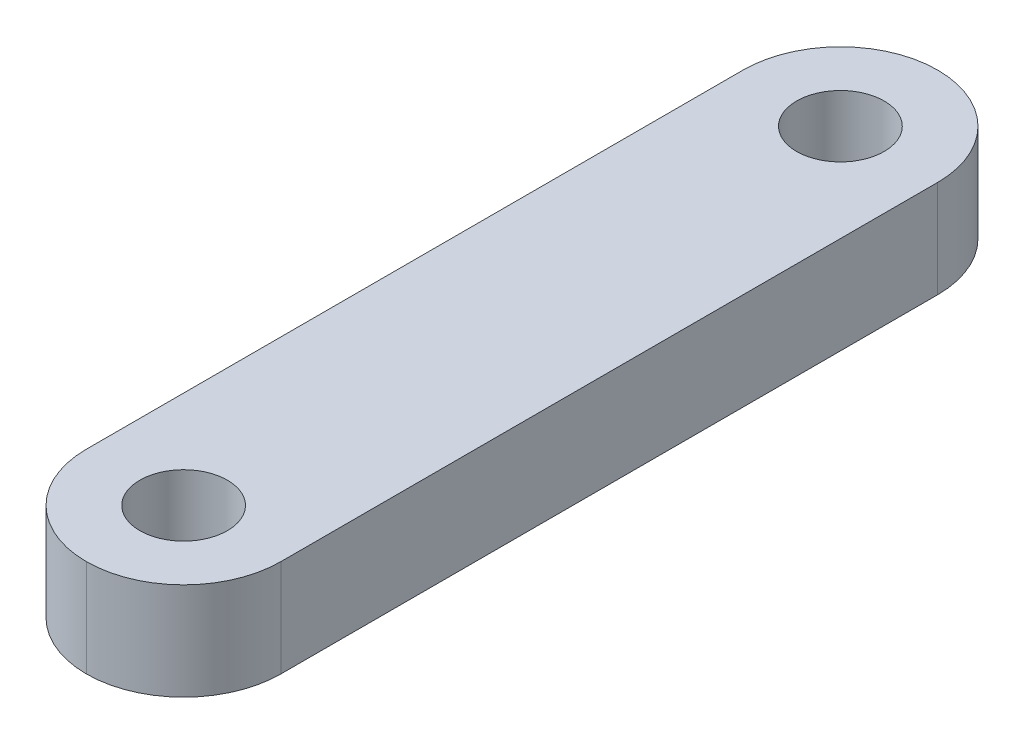
ISO-10303-21;
HEADER;
FILE_DESCRIPTION(('STEP AP214'),'2;1');
FILE_NAME('part.step','',(''),(''),'','','');
FILE_SCHEMA(('AUTOMOTIVE_DESIGN { 1 0 10303 214 1 1 1 1 }'));
ENDSEC;
DATA;
#1=APPLICATION_CONTEXT('core data for automotive mechanical design processes');
#2=APPLICATION_PROTOCOL_DEFINITION('international standard','automotive_design',2000,#1);
#3=PRODUCT_CONTEXT('',#1,'mechanical');
#4=PRODUCT('Part','Part','',(#3));
#5=PRODUCT_RELATED_PRODUCT_CATEGORY('part','',(#4));
#6=PRODUCT_DEFINITION_FORMATION('','',#4);
#7=PRODUCT_DEFINITION_CONTEXT('part definition',#1,'design');
#8=PRODUCT_DEFINITION('design','',#6,#7);
#9=PRODUCT_DEFINITION_SHAPE('','',#8);
#10=(LENGTH_UNIT() NAMED_UNIT(*) SI_UNIT(.MILLI.,.METRE.));
#11=(NAMED_UNIT(*) PLANE_ANGLE_UNIT() SI_UNIT($,.RADIAN.));
#12=(NAMED_UNIT(*) SI_UNIT($,.STERADIAN.) SOLID_ANGLE_UNIT());
#13=UNCERTAINTY_MEASURE_WITH_UNIT(LENGTH_MEASURE(1.E-05),#10,'distance_accuracy_value','');
#14=(GEOMETRIC_REPRESENTATION_CONTEXT(3) GLOBAL_UNCERTAINTY_ASSIGNED_CONTEXT((#13)) GLOBAL_UNIT_ASSIGNED_CONTEXT((#10,
#11,#12)) REPRESENTATION_CONTEXT('',''));
#15=CARTESIAN_POINT('',(0.,0.,0.));
#16=DIRECTION('',(0.,0.,1.));
#17=DIRECTION('',(1.,0.,0.));
#18=AXIS2_PLACEMENT_3D('',#15,#16,#17);
#19=CARTESIAN_POINT('',(0.,0.,35.));
#20=DIRECTION('',(1.,0.,0.));
#21=DIRECTION('',(0.,1.,0.));
#22=AXIS2_PLACEMENT_3D('',#19,#20,#21);
#23=PLANE('',#22);
#24=DIRECTION('',(0.,0.,-1.));
#25=VECTOR('',#24,1.);
#26=CARTESIAN_POINT('',(0.,0.,35.));
#27=LINE('',#26,#25);
#28=CARTESIAN_POINT('',(0.,0.,31.));
#29=VERTEX_POINT('',#28);
#30=CARTESIAN_POINT('',(0.,0.,4.));
#31=VERTEX_POINT('',#30);
#32=EDGE_CURVE('E140',#29,#31,#27,.T.);
#33=ORIENTED_EDGE('',*,*,#32,.T.);
#34=DIRECTION('',(0.,-1.,0.));
#35=VECTOR('',#34,1.);
#36=CARTESIAN_POINT('',(0.,0.,4.));
#37=LINE('',#36,#35);
#38=CARTESIAN_POINT('',(0.,-4.,4.));
#39=VERTEX_POINT('',#38);
#40=EDGE_CURVE('E107',#31,#39,#37,.T.);
#41=ORIENTED_EDGE('',*,*,#40,.T.);
#42=DIRECTION('',(0.,0.,-1.));
#43=VECTOR('',#42,1.);
#44=CARTESIAN_POINT('',(0.,-4.,35.));
#45=LINE('',#44,#43);
#46=CARTESIAN_POINT('',(0.,-4.,31.));
#47=VERTEX_POINT('',#46);
#48=EDGE_CURVE('E90',#47,#39,#45,.T.);
#49=ORIENTED_EDGE('',*,*,#48,.F.);
#50=DIRECTION('',(0.,-1.,0.));
#51=VECTOR('',#50,1.);
#52=CARTESIAN_POINT('',(0.,0.,31.));
#53=LINE('',#52,#51);
#54=EDGE_CURVE('E104',#47,#29,#53,.F.);
#55=ORIENTED_EDGE('',*,*,#54,.T.);
#56=EDGE_LOOP('',(#33,#41,#49,#55));
#57=FACE_BOUND('',#56,.T.);
#58=ADVANCED_FACE('F33',(#57),#23,.F.);
#59=CARTESIAN_POINT('',(0.,-4.,35.));
#60=DIRECTION('',(0.,1.,0.));
#61=DIRECTION('',(0.,0.,1.));
#62=AXIS2_PLACEMENT_3D('',#59,#60,#61);
#63=PLANE('',#62);
#64=CARTESIAN_POINT('',(4.,-4.,31.));
#65=DIRECTION('',(0.,1.,0.));
#66=DIRECTION('',(0.,0.,1.));
#67=AXIS2_PLACEMENT_3D('',#64,#65,#66);
#68=CIRCLE('',#67,1.8);
#69=CARTESIAN_POINT('',(4.,-4.,32.8));
#70=VERTEX_POINT('',#69);
#71=EDGE_CURVE('E133',#70,#70,#68,.T.);
#72=ORIENTED_EDGE('',*,*,#71,.T.);
#73=EDGE_LOOP('',(#72));
#74=FACE_BOUND('',#73,.T.);
#75=CARTESIAN_POINT('',(4.,-4.,4.));
#76=DIRECTION('',(0.,1.,0.));
#77=DIRECTION('',(0.,0.,1.));
#78=AXIS2_PLACEMENT_3D('',#75,#76,#77);
#79=CIRCLE('',#78,1.8);
#80=CARTESIAN_POINT('',(4.,-4.,5.8));
#81=VERTEX_POINT('',#80);
#82=EDGE_CURVE('E144',#81,#81,#79,.T.);
#83=ORIENTED_EDGE('',*,*,#82,.T.);
#84=EDGE_LOOP('',(#83));
#85=FACE_BOUND('',#84,.T.);
#86=ORIENTED_EDGE('',*,*,#48,.T.);
#87=CARTESIAN_POINT('',(4.,-4.,4.));
#88=DIRECTION('',(0.,1.,0.));
#89=DIRECTION('',(0.,0.,1.));
#90=AXIS2_PLACEMENT_3D('',#87,#88,#89);
#91=CIRCLE('',#90,4.);
#92=CARTESIAN_POINT('',(4.,-4.,0.));
#93=VERTEX_POINT('',#92);
#94=EDGE_CURVE('E118',#39,#93,#91,.F.);
#95=ORIENTED_EDGE('',*,*,#94,.T.);
#96=CARTESIAN_POINT('',(4.,-4.,4.));
#97=DIRECTION('',(0.,1.,0.));
#98=DIRECTION('',(0.,0.,1.));
#99=AXIS2_PLACEMENT_3D('',#96,#97,#98);
#100=CIRCLE('',#99,4.);
#101=CARTESIAN_POINT('',(8.,-4.,4.));
#102=VERTEX_POINT('',#101);
#103=EDGE_CURVE('E98',#93,#102,#100,.F.);
#104=ORIENTED_EDGE('',*,*,#103,.T.);
#105=DIRECTION('',(0.,0.,-1.));
#106=VECTOR('',#105,1.);
#107=CARTESIAN_POINT('',(8.,-4.,35.));
#108=LINE('',#107,#106);
#109=CARTESIAN_POINT('',(8.,-4.,31.));
#110=VERTEX_POINT('',#109);
#111=EDGE_CURVE('E108',#110,#102,#108,.T.);
#112=ORIENTED_EDGE('',*,*,#111,.F.);
#113=CARTESIAN_POINT('',(4.,-4.,31.));
#114=DIRECTION('',(0.,1.,0.));
#115=DIRECTION('',(0.,0.,1.));
#116=AXIS2_PLACEMENT_3D('',#113,#114,#115);
#117=CIRCLE('',#116,4.);
#118=CARTESIAN_POINT('',(4.,-4.,35.));
#119=VERTEX_POINT('',#118);
#120=EDGE_CURVE('E93',#110,#119,#117,.F.);
#121=ORIENTED_EDGE('',*,*,#120,.T.);
#122=CARTESIAN_POINT('',(4.,-4.,31.));
#123=DIRECTION('',(0.,1.,0.));
#124=DIRECTION('',(0.,0.,1.));
#125=AXIS2_PLACEMENT_3D('',#122,#123,#124);
#126=CIRCLE('',#125,4.);
#127=EDGE_CURVE('E87',#119,#47,#126,.F.);
#128=ORIENTED_EDGE('',*,*,#127,.T.);
#129=EDGE_LOOP('',(#86,#95,#104,#112,#121,#128));
#130=FACE_BOUND('',#129,.T.);
#131=ADVANCED_FACE('F89',(#74,#85,#130),#63,.F.);
#132=CARTESIAN_POINT('',(8.,0.,35.));
#133=DIRECTION('',(-1.,0.,0.));
#134=DIRECTION('',(0.,-1.,0.));
#135=AXIS2_PLACEMENT_3D('',#132,#133,#134);
#136=PLANE('',#135);
#137=ORIENTED_EDGE('',*,*,#111,.T.);
#138=DIRECTION('',(0.,1.,0.));
#139=VECTOR('',#138,1.);
#140=CARTESIAN_POINT('',(8.,0.,4.));
#141=LINE('',#140,#139);
#142=CARTESIAN_POINT('',(8.,0.,4.));
#143=VERTEX_POINT('',#142);
#144=EDGE_CURVE('E11',#102,#143,#141,.T.);
#145=ORIENTED_EDGE('',*,*,#144,.T.);
#146=DIRECTION('',(0.,0.,-1.));
#147=VECTOR('',#146,1.);
#148=CARTESIAN_POINT('',(8.,0.,35.));
#149=LINE('',#148,#147);
#150=CARTESIAN_POINT('',(8.,0.,31.));
#151=VERTEX_POINT('',#150);
#152=EDGE_CURVE('E138',#151,#143,#149,.T.);
#153=ORIENTED_EDGE('',*,*,#152,.F.);
#154=DIRECTION('',(0.,1.,0.));
#155=VECTOR('',#154,1.);
#156=CARTESIAN_POINT('',(8.,-4.,31.));
#157=LINE('',#156,#155);
#158=EDGE_CURVE('E42',#151,#110,#157,.F.);
#159=ORIENTED_EDGE('',*,*,#158,.T.);
#160=EDGE_LOOP('',(#137,#145,#153,#159));
#161=FACE_BOUND('',#160,.T.);
#162=ADVANCED_FACE('F137',(#161),#136,.F.);
#163=CARTESIAN_POINT('',(0.,0.,35.));
#164=DIRECTION('',(0.,-1.,0.));
#165=DIRECTION('',(0.,0.,-1.));
#166=AXIS2_PLACEMENT_3D('',#163,#164,#165);
#167=PLANE('',#166);
#168=CARTESIAN_POINT('',(4.,0.,31.));
#169=DIRECTION('',(0.,1.,0.));
#170=DIRECTION('',(0.,0.,1.));
#171=AXIS2_PLACEMENT_3D('',#168,#169,#170);
#172=CIRCLE('',#171,1.8);
#173=CARTESIAN_POINT('',(4.,0.,32.8));
#174=VERTEX_POINT('',#173);
#175=EDGE_CURVE('E128',#174,#174,#172,.T.);
#176=ORIENTED_EDGE('',*,*,#175,.F.);
#177=EDGE_LOOP('',(#176));
#178=FACE_BOUND('',#177,.T.);
#179=CARTESIAN_POINT('',(4.,0.,4.));
#180=DIRECTION('',(0.,1.,0.));
#181=DIRECTION('',(0.,0.,1.));
#182=AXIS2_PLACEMENT_3D('',#179,#180,#181);
#183=CIRCLE('',#182,1.8);
#184=CARTESIAN_POINT('',(4.,0.,5.8));
#185=VERTEX_POINT('',#184);
#186=EDGE_CURVE('E145',#185,#185,#183,.T.);
#187=ORIENTED_EDGE('',*,*,#186,.F.);
#188=EDGE_LOOP('',(#187));
#189=FACE_BOUND('',#188,.T.);
#190=CARTESIAN_POINT('',(4.,0.,4.));
#191=DIRECTION('',(0.,-1.,0.));
#192=DIRECTION('',(0.,0.,-1.));
#193=AXIS2_PLACEMENT_3D('',#190,#191,#192);
#194=CIRCLE('',#193,4.);
#195=CARTESIAN_POINT('',(4.,0.,0.));
#196=VERTEX_POINT('',#195);
#197=EDGE_CURVE('E122',#143,#196,#194,.F.);
#198=ORIENTED_EDGE('',*,*,#197,.T.);
#199=CARTESIAN_POINT('',(4.,0.,4.));
#200=DIRECTION('',(0.,-1.,0.));
#201=DIRECTION('',(0.,0.,-1.));
#202=AXIS2_PLACEMENT_3D('',#199,#200,#201);
#203=CIRCLE('',#202,4.);
#204=EDGE_CURVE('E124',#196,#31,#203,.F.);
#205=ORIENTED_EDGE('',*,*,#204,.T.);
#206=ORIENTED_EDGE('',*,*,#32,.F.);
#207=CARTESIAN_POINT('',(4.,0.,31.));
#208=DIRECTION('',(0.,-1.,0.));
#209=DIRECTION('',(0.,0.,-1.));
#210=AXIS2_PLACEMENT_3D('',#207,#208,#209);
#211=CIRCLE('',#210,4.);
#212=CARTESIAN_POINT('',(4.,0.,35.));
#213=VERTEX_POINT('',#212);
#214=EDGE_CURVE('E111',#29,#213,#211,.F.);
#215=ORIENTED_EDGE('',*,*,#214,.T.);
#216=CARTESIAN_POINT('',(4.,0.,31.));
#217=DIRECTION('',(0.,-1.,0.));
#218=DIRECTION('',(0.,0.,-1.));
#219=AXIS2_PLACEMENT_3D('',#216,#217,#218);
#220=CIRCLE('',#219,4.);
#221=EDGE_CURVE('E55',#213,#151,#220,.F.);
#222=ORIENTED_EDGE('',*,*,#221,.T.);
#223=ORIENTED_EDGE('',*,*,#152,.T.);
#224=EDGE_LOOP('',(#198,#205,#206,#215,#222,#223));
#225=FACE_BOUND('',#224,.T.);
#226=ADVANCED_FACE('F163',(#178,#189,#225),#167,.F.);
#227=CARTESIAN_POINT('',(4.,-4.,4.));
#228=DIRECTION('',(0.,1.,0.));
#229=DIRECTION('',(0.,0.,1.));
#230=AXIS2_PLACEMENT_3D('',#227,#228,#229);
#231=CYLINDRICAL_SURFACE('',#230,1.8);
#232=ORIENTED_EDGE('',*,*,#82,.F.);
#233=EDGE_LOOP('',(#232));
#234=FACE_BOUND('',#233,.T.);
#235=ORIENTED_EDGE('',*,*,#186,.T.);
#236=EDGE_LOOP('',(#235));
#237=FACE_BOUND('',#236,.T.);
#238=ADVANCED_FACE('F159',(#234,#237),#231,.F.);
#239=CARTESIAN_POINT('',(4.,-4.,31.));
#240=DIRECTION('',(0.,1.,0.));
#241=DIRECTION('',(0.,0.,1.));
#242=AXIS2_PLACEMENT_3D('',#239,#240,#241);
#243=CYLINDRICAL_SURFACE('',#242,1.8);
#244=ORIENTED_EDGE('',*,*,#71,.F.);
#245=EDGE_LOOP('',(#244));
#246=FACE_BOUND('',#245,.T.);
#247=ORIENTED_EDGE('',*,*,#175,.T.);
#248=EDGE_LOOP('',(#247));
#249=FACE_BOUND('',#248,.T.);
#250=ADVANCED_FACE('F155',(#246,#249),#243,.F.);
#251=CARTESIAN_POINT('',(4.,0.,4.));
#252=DIRECTION('',(0.,1.,0.));
#253=DIRECTION('',(-1.,0.,0.));
#254=AXIS2_PLACEMENT_3D('',#251,#252,#253);
#255=CYLINDRICAL_SURFACE('',#254,4.);
#256=DIRECTION('',(0.,1.,0.));
#257=VECTOR('',#256,1.);
#258=CARTESIAN_POINT('',(4.,0.,0.));
#259=LINE('',#258,#257);
#260=EDGE_CURVE('E126',#196,#93,#259,.F.);
#261=ORIENTED_EDGE('',*,*,#260,.F.);
#262=ORIENTED_EDGE('',*,*,#197,.F.);
#263=ORIENTED_EDGE('',*,*,#144,.F.);
#264=ORIENTED_EDGE('',*,*,#103,.F.);
#265=EDGE_LOOP('',(#261,#262,#263,#264));
#266=FACE_BOUND('',#265,.T.);
#267=ADVANCED_FACE('F158',(#266),#255,.T.);
#268=CARTESIAN_POINT('',(4.,0.,4.));
#269=DIRECTION('',(0.,-1.,0.));
#270=DIRECTION('',(1.,0.,0.));
#271=AXIS2_PLACEMENT_3D('',#268,#269,#270);
#272=CYLINDRICAL_SURFACE('',#271,4.);
#273=ORIENTED_EDGE('',*,*,#204,.F.);
#274=ORIENTED_EDGE('',*,*,#260,.T.);
#275=ORIENTED_EDGE('',*,*,#94,.F.);
#276=ORIENTED_EDGE('',*,*,#40,.F.);
#277=EDGE_LOOP('',(#273,#274,#275,#276));
#278=FACE_BOUND('',#277,.T.);
#279=ADVANCED_FACE('F170',(#278),#272,.T.);
#280=CARTESIAN_POINT('',(4.,0.,31.));
#281=DIRECTION('',(0.,-1.,0.));
#282=DIRECTION('',(1.,0.,0.));
#283=AXIS2_PLACEMENT_3D('',#280,#281,#282);
#284=CYLINDRICAL_SURFACE('',#283,4.);
#285=ORIENTED_EDGE('',*,*,#158,.F.);
#286=ORIENTED_EDGE('',*,*,#221,.F.);
#287=DIRECTION('',(0.,1.,0.));
#288=VECTOR('',#287,1.);
#289=CARTESIAN_POINT('',(4.,0.,35.));
#290=LINE('',#289,#288);
#291=EDGE_CURVE('E37',#119,#213,#290,.T.);
#292=ORIENTED_EDGE('',*,*,#291,.F.);
#293=ORIENTED_EDGE('',*,*,#120,.F.);
#294=EDGE_LOOP('',(#285,#286,#292,#293));
#295=FACE_BOUND('',#294,.T.);
#296=ADVANCED_FACE('F35',(#295),#284,.T.);
#297=CARTESIAN_POINT('',(4.,0.,31.));
#298=DIRECTION('',(0.,1.,0.));
#299=DIRECTION('',(-1.,0.,0.));
#300=AXIS2_PLACEMENT_3D('',#297,#298,#299);
#301=CYLINDRICAL_SURFACE('',#300,4.);
#302=ORIENTED_EDGE('',*,*,#214,.F.);
#303=ORIENTED_EDGE('',*,*,#54,.F.);
#304=ORIENTED_EDGE('',*,*,#127,.F.);
#305=ORIENTED_EDGE('',*,*,#291,.T.);
#306=EDGE_LOOP('',(#302,#303,#304,#305));
#307=FACE_BOUND('',#306,.T.);
#308=ADVANCED_FACE('F110',(#307),#301,.T.);
#309=CLOSED_SHELL('',(#58,#131,#162,#226,#238,#250,#267,#279,#296,#308));
#310=MANIFOLD_SOLID_BREP('B2',#309);
#311=ADVANCED_BREP_SHAPE_REPRESENTATION('',(#18,#310),#14);
#312=SHAPE_DEFINITION_REPRESENTATION(#9,#311);
ENDSEC;
END-ISO-10303-21;
